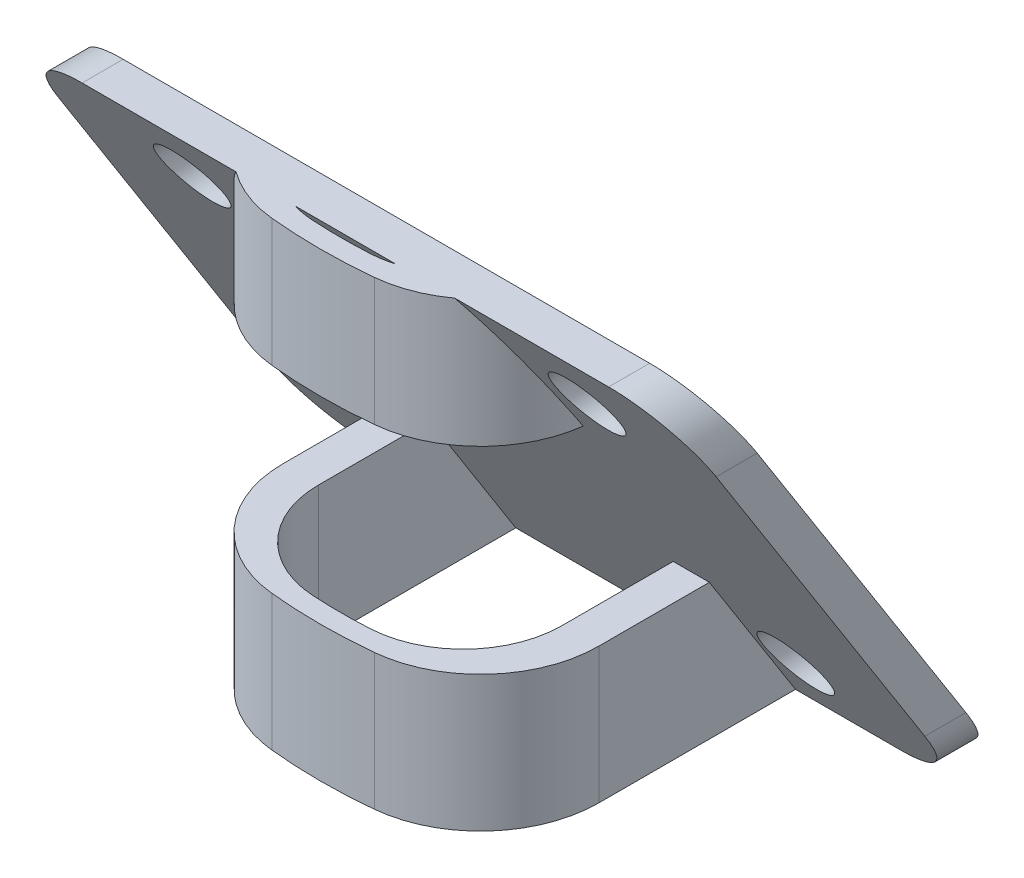
ISO-10303-21;
HEADER;
FILE_DESCRIPTION(('STEP AP214'),'2;1');
FILE_NAME('part.step','',(''),(''),'','','');
FILE_SCHEMA(('AUTOMOTIVE_DESIGN { 1 0 10303 214 1 1 1 1 }'));
ENDSEC;
DATA;
#1=APPLICATION_CONTEXT('core data for automotive mechanical design processes');
#2=APPLICATION_PROTOCOL_DEFINITION('international standard','automotive_design',2000,#1);
#3=PRODUCT_CONTEXT('',#1,'mechanical');
#4=PRODUCT('Part','Part','',(#3));
#5=PRODUCT_RELATED_PRODUCT_CATEGORY('part','',(#4));
#6=PRODUCT_DEFINITION_FORMATION('','',#4);
#7=PRODUCT_DEFINITION_CONTEXT('part definition',#1,'design');
#8=PRODUCT_DEFINITION('design','',#6,#7);
#9=PRODUCT_DEFINITION_SHAPE('','',#8);
#10=(LENGTH_UNIT() NAMED_UNIT(*) SI_UNIT(.MILLI.,.METRE.));
#11=(NAMED_UNIT(*) PLANE_ANGLE_UNIT() SI_UNIT($,.RADIAN.));
#12=(NAMED_UNIT(*) SI_UNIT($,.STERADIAN.) SOLID_ANGLE_UNIT());
#13=UNCERTAINTY_MEASURE_WITH_UNIT(LENGTH_MEASURE(1.E-05),#10,'distance_accuracy_value','');
#14=(GEOMETRIC_REPRESENTATION_CONTEXT(3) GLOBAL_UNCERTAINTY_ASSIGNED_CONTEXT((#13)) GLOBAL_UNIT_ASSIGNED_CONTEXT((#10,
#11,#12)) REPRESENTATION_CONTEXT('',''));
#15=CARTESIAN_POINT('',(0.,0.,0.));
#16=DIRECTION('',(0.,0.,1.));
#17=DIRECTION('',(1.,0.,0.));
#18=AXIS2_PLACEMENT_3D('',#15,#16,#17);
#19=CARTESIAN_POINT('',(26.,19.3633006070035,-108.491488000485));
#20=DIRECTION('',(1.,0.,0.));
#21=DIRECTION('',(0.,1.,0.));
#22=AXIS2_PLACEMENT_3D('',#19,#20,#21);
#23=PLANE('',#22);
#24=DIRECTION('',(0.,0.,1.));
#25=VECTOR('',#24,1.);
#26=CARTESIAN_POINT('',(26.,-50.6366993929965,-108.491488000485));
#27=LINE('',#26,#25);
#28=CARTESIAN_POINT('',(26.,-50.6366993929965,-37.9982236628717));
#29=VERTEX_POINT('',#28);
#30=CARTESIAN_POINT('',(26.,-50.6366993929965,-8.1341792972629));
#31=VERTEX_POINT('',#30);
#32=EDGE_CURVE('E250',#29,#31,#27,.T.);
#33=ORIENTED_EDGE('',*,*,#32,.T.);
#34=DIRECTION('',(0.,-1.,0.));
#35=VECTOR('',#34,1.);
#36=CARTESIAN_POINT('',(26.,-30.,-8.13417929726291));
#37=LINE('',#36,#35);
#38=CARTESIAN_POINT('',(26.,-30.,-8.1341792972629));
#39=VERTEX_POINT('',#38);
#40=EDGE_CURVE('E374',#31,#39,#37,.F.);
#41=ORIENTED_EDGE('',*,*,#40,.T.);
#42=DIRECTION('',(0.,0.,-1.));
#43=VECTOR('',#42,1.);
#44=CARTESIAN_POINT('',(26.,-30.,-108.491488000485));
#45=LINE('',#44,#43);
#46=CARTESIAN_POINT('',(26.,-30.,-24.9086112176693));
#47=VERTEX_POINT('',#46);
#48=EDGE_CURVE('E452',#39,#47,#45,.T.);
#49=ORIENTED_EDGE('',*,*,#48,.T.);
#50=DIRECTION('',(0.,0.844454440994229,0.535627386421871));
#51=VECTOR('',#50,1.);
#52=CARTESIAN_POINT('',(26.,-32.6044827871345,-26.5606036053357));
#53=LINE('',#52,#51);
#54=EDGE_CURVE('E246',#29,#47,#53,.T.);
#55=ORIENTED_EDGE('',*,*,#54,.F.);
#56=EDGE_LOOP('',(#33,#41,#49,#55));
#57=FACE_BOUND('',#56,.T.);
#58=ADVANCED_FACE('F35',(#57),#23,.F.);
#59=CARTESIAN_POINT('',(74.,19.3633006070035,-108.491488000485));
#60=DIRECTION('',(-1.,0.,0.));
#61=DIRECTION('',(0.,-1.,0.));
#62=AXIS2_PLACEMENT_3D('',#59,#60,#61);
#63=PLANE('',#62);
#64=DIRECTION('',(0.,0.,-1.));
#65=VECTOR('',#64,1.);
#66=CARTESIAN_POINT('',(74.,-30.,34.0291012034157));
#67=LINE('',#66,#65);
#68=CARTESIAN_POINT('',(74.,-30.,-8.13417929726291));
#69=VERTEX_POINT('',#68);
#70=CARTESIAN_POINT('',(74.,-30.,-24.9086112176693));
#71=VERTEX_POINT('',#70);
#72=EDGE_CURVE('E219',#69,#71,#67,.T.);
#73=ORIENTED_EDGE('',*,*,#72,.F.);
#74=DIRECTION('',(0.,-1.,0.));
#75=VECTOR('',#74,1.);
#76=CARTESIAN_POINT('',(74.,-50.6366993929965,-8.13417929726291));
#77=LINE('',#76,#75);
#78=CARTESIAN_POINT('',(74.,-50.6366993929965,-8.1341792972629));
#79=VERTEX_POINT('',#78);
#80=EDGE_CURVE('E361',#69,#79,#77,.T.);
#81=ORIENTED_EDGE('',*,*,#80,.T.);
#82=DIRECTION('',(0.,0.,1.));
#83=VECTOR('',#82,1.);
#84=CARTESIAN_POINT('',(74.,-50.6366993929965,-108.491488000485));
#85=LINE('',#84,#83);
#86=CARTESIAN_POINT('',(74.,-50.6366993929965,-37.9982236628717));
#87=VERTEX_POINT('',#86);
#88=EDGE_CURVE('E245',#87,#79,#85,.T.);
#89=ORIENTED_EDGE('',*,*,#88,.F.);
#90=DIRECTION('',(0.,-0.844454440994229,-0.535627386421871));
#91=VECTOR('',#90,1.);
#92=CARTESIAN_POINT('',(74.,-32.6044827871345,-26.5606036053357));
#93=LINE('',#92,#91);
#94=EDGE_CURVE('E236',#71,#87,#93,.T.);
#95=ORIENTED_EDGE('',*,*,#94,.F.);
#96=EDGE_LOOP('',(#73,#81,#89,#95));
#97=FACE_BOUND('',#96,.T.);
#98=ADVANCED_FACE('F243',(#97),#63,.F.);
#99=CARTESIAN_POINT('',(50.,-50.6366993929965,-68.2616321370809));
#100=DIRECTION('',(0.,1.,0.));
#101=DIRECTION('',(0.,0.,1.));
#102=AXIS2_PLACEMENT_3D('',#99,#100,#101);
#103=CYLINDRICAL_SURFACE('',#102,78.4260753731743);
#104=CARTESIAN_POINT('',(50.,-50.6366993929965,-68.2616321370809));
#105=DIRECTION('',(0.,1.,0.));
#106=DIRECTION('',(0.,0.,-1.));
#107=AXIS2_PLACEMENT_3D('',#104,#105,#106);
#108=CIRCLE('',#107,78.4260753731743);
#109=CARTESIAN_POINT('',(42.2126921311202,-50.6366993929965,9.77686563545502));
#110=VERTEX_POINT('',#109);
#111=CARTESIAN_POINT('',(57.7873078688798,-50.6366993929965,9.77686563545502));
#112=VERTEX_POINT('',#111);
#113=EDGE_CURVE('E247',#110,#112,#108,.T.);
#114=ORIENTED_EDGE('',*,*,#113,.T.);
#115=DIRECTION('',(0.,1.,0.));
#116=VECTOR('',#115,1.);
#117=CARTESIAN_POINT('',(57.7873078688798,-50.6366993929965,9.77686563545502));
#118=LINE('',#117,#116);
#119=CARTESIAN_POINT('',(57.7873078688798,-30.,9.77686563545502));
#120=VERTEX_POINT('',#119);
#121=EDGE_CURVE('E369',#112,#120,#118,.T.);
#122=ORIENTED_EDGE('',*,*,#121,.T.);
#123=CARTESIAN_POINT('',(50.,-30.,-68.2616321370809));
#124=DIRECTION('',(0.,-1.,0.));
#125=DIRECTION('',(1.,0.,0.));
#126=AXIS2_PLACEMENT_3D('',#123,#124,#125);
#127=CIRCLE('',#126,78.4260753731743);
#128=CARTESIAN_POINT('',(42.2126921311202,-30.,9.77686563545502));
#129=VERTEX_POINT('',#128);
#130=EDGE_CURVE('E457',#129,#120,#127,.F.);
#131=ORIENTED_EDGE('',*,*,#130,.F.);
#132=DIRECTION('',(0.,1.,0.));
#133=VECTOR('',#132,1.);
#134=CARTESIAN_POINT('',(42.2126921311202,-50.6366993929965,9.77686563545503));
#135=LINE('',#134,#133);
#136=EDGE_CURVE('E367',#129,#110,#135,.F.);
#137=ORIENTED_EDGE('',*,*,#136,.T.);
#138=EDGE_LOOP('',(#114,#122,#131,#137));
#139=FACE_BOUND('',#138,.T.);
#140=ADVANCED_FACE('F562',(#139),#103,.T.);
#141=CARTESIAN_POINT('',(50.,68.5170607209144,-68.2616321370809));
#142=DIRECTION('',(0.,-1.,0.));
#143=DIRECTION('',(0.,0.,-1.));
#144=AXIS2_PLACEMENT_3D('',#141,#142,#143);
#145=CYLINDRICAL_SURFACE('',#144,75.3486546940733);
#146=CARTESIAN_POINT('',(50.,-30.,-68.2616321370809));
#147=DIRECTION('',(0.,-1.,0.));
#148=DIRECTION('',(1.,0.,0.));
#149=AXIS2_PLACEMENT_3D('',#146,#147,#148);
#150=CIRCLE('',#149,75.3486546940733);
#151=CARTESIAN_POINT('',(45.6250623052723,-30.,6.95990523336866));
#152=VERTEX_POINT('',#151);
#153=CARTESIAN_POINT('',(54.3749376947277,-30.,6.95990523336866));
#154=VERTEX_POINT('',#153);
#155=EDGE_CURVE('E462',#152,#154,#150,.F.);
#156=ORIENTED_EDGE('',*,*,#155,.T.);
#157=DIRECTION('',(0.,-1.,0.));
#158=VECTOR('',#157,1.);
#159=CARTESIAN_POINT('',(54.3749376947277,68.5170607209144,6.95990523336866));
#160=LINE('',#159,#158);
#161=CARTESIAN_POINT('',(54.3749376947277,-50.6366993929965,6.95990523336866));
#162=VERTEX_POINT('',#161);
#163=EDGE_CURVE('E384',#154,#162,#160,.T.);
#164=ORIENTED_EDGE('',*,*,#163,.T.);
#165=CARTESIAN_POINT('',(50.,-50.6366993929965,-68.2616321370809));
#166=DIRECTION('',(0.,-1.,0.));
#167=DIRECTION('',(0.,0.,-1.));
#168=AXIS2_PLACEMENT_3D('',#165,#166,#167);
#169=CIRCLE('',#168,75.3486546940733);
#170=CARTESIAN_POINT('',(45.6250623052723,-50.6366993929965,6.95990523336866));
#171=VERTEX_POINT('',#170);
#172=EDGE_CURVE('E451',#162,#171,#169,.T.);
#173=ORIENTED_EDGE('',*,*,#172,.T.);
#174=DIRECTION('',(0.,-1.,0.));
#175=VECTOR('',#174,1.);
#176=CARTESIAN_POINT('',(45.6250623052723,68.5170607209144,6.95990523336866));
#177=LINE('',#176,#175);
#178=EDGE_CURVE('E382',#171,#152,#177,.F.);
#179=ORIENTED_EDGE('',*,*,#178,.T.);
#180=EDGE_LOOP('',(#156,#164,#173,#179));
#181=FACE_BOUND('',#180,.T.);
#182=ADVANCED_FACE('F539',(#181),#145,.F.);
#183=CARTESIAN_POINT('',(31.4960010856308,68.5170607209144,-37.9982236628717));
#184=DIRECTION('',(-1.,0.,0.));
#185=DIRECTION('',(0.,0.,1.));
#186=AXIS2_PLACEMENT_3D('',#183,#184,#185);
#187=PLANE('',#186);
#188=DIRECTION('',(0.,0.,1.));
#189=VECTOR('',#188,1.);
#190=CARTESIAN_POINT('',(31.4960010856308,-30.,-37.9982236628717));
#191=LINE('',#190,#189);
#192=CARTESIAN_POINT('',(31.4960010856308,-30.,-24.9086112176693));
#193=VERTEX_POINT('',#192);
#194=CARTESIAN_POINT('',(31.4960010856308,-30.,-8.01478894183463));
#195=VERTEX_POINT('',#194);
#196=EDGE_CURVE('E459',#193,#195,#191,.T.);
#197=ORIENTED_EDGE('',*,*,#196,.T.);
#198=DIRECTION('',(0.,1.,0.));
#199=VECTOR('',#198,1.);
#200=CARTESIAN_POINT('',(31.4960010856308,-50.6366993929965,-8.01478894183463));
#201=LINE('',#200,#199);
#202=CARTESIAN_POINT('',(31.4960010856308,-50.6366993929965,-8.01478894183463));
#203=VERTEX_POINT('',#202);
#204=EDGE_CURVE('E389',#195,#203,#201,.F.);
#205=ORIENTED_EDGE('',*,*,#204,.T.);
#206=DIRECTION('',(0.,0.,-1.));
#207=VECTOR('',#206,1.);
#208=CARTESIAN_POINT('',(31.4960010856308,-50.6366993929965,-37.9982236628717));
#209=LINE('',#208,#207);
#210=CARTESIAN_POINT('',(31.4960010856308,-50.6366993929965,-37.9982236628717));
#211=VERTEX_POINT('',#210);
#212=EDGE_CURVE('E447',#203,#211,#209,.T.);
#213=ORIENTED_EDGE('',*,*,#212,.T.);
#214=DIRECTION('',(0.,-0.844454440994229,-0.535627386421871));
#215=VECTOR('',#214,1.);
#216=CARTESIAN_POINT('',(31.4960010856308,34.3322404989602,15.8965621206953));
#217=LINE('',#216,#215);
#218=EDGE_CURVE('E441',#193,#211,#217,.T.);
#219=ORIENTED_EDGE('',*,*,#218,.F.);
#220=EDGE_LOOP('',(#197,#205,#213,#219));
#221=FACE_BOUND('',#220,.T.);
#222=ADVANCED_FACE('F530',(#221),#187,.F.);
#223=CARTESIAN_POINT('',(68.5039989143692,68.5170607209144,-37.9982236628717));
#224=DIRECTION('',(1.,0.,0.));
#225=DIRECTION('',(0.,0.,-1.));
#226=AXIS2_PLACEMENT_3D('',#223,#224,#225);
#227=PLANE('',#226);
#228=DIRECTION('',(0.,0.,1.));
#229=VECTOR('',#228,1.);
#230=CARTESIAN_POINT('',(68.5039989143692,-50.6366993929965,-37.9982236628717));
#231=LINE('',#230,#229);
#232=CARTESIAN_POINT('',(68.5039989143692,-50.6366993929965,-37.9982236628717));
#233=VERTEX_POINT('',#232);
#234=CARTESIAN_POINT('',(68.5039989143692,-50.6366993929965,-8.01478894183463));
#235=VERTEX_POINT('',#234);
#236=EDGE_CURVE('E448',#233,#235,#231,.T.);
#237=ORIENTED_EDGE('',*,*,#236,.T.);
#238=DIRECTION('',(0.,1.,0.));
#239=VECTOR('',#238,1.);
#240=CARTESIAN_POINT('',(68.5039989143692,-30.,-8.01478894183463));
#241=LINE('',#240,#239);
#242=CARTESIAN_POINT('',(68.5039989143692,-30.,-8.01478894183463));
#243=VERTEX_POINT('',#242);
#244=EDGE_CURVE('E387',#235,#243,#241,.T.);
#245=ORIENTED_EDGE('',*,*,#244,.T.);
#246=DIRECTION('',(0.,0.,-1.));
#247=VECTOR('',#246,1.);
#248=CARTESIAN_POINT('',(68.5039989143692,-30.,-37.9982236628717));
#249=LINE('',#248,#247);
#250=CARTESIAN_POINT('',(68.5039989143692,-30.,-24.9086112176693));
#251=VERTEX_POINT('',#250);
#252=EDGE_CURVE('E344',#243,#251,#249,.T.);
#253=ORIENTED_EDGE('',*,*,#252,.T.);
#254=DIRECTION('',(0.,0.844454440994229,0.535627386421871));
#255=VECTOR('',#254,1.);
#256=CARTESIAN_POINT('',(68.5039989143692,34.3322404989602,15.8965621206953));
#257=LINE('',#256,#255);
#258=EDGE_CURVE('E239',#233,#251,#257,.T.);
#259=ORIENTED_EDGE('',*,*,#258,.F.);
#260=EDGE_LOOP('',(#237,#245,#253,#259));
#261=FACE_BOUND('',#260,.T.);
#262=ADVANCED_FACE('F547',(#261),#227,.F.);
#263=CARTESIAN_POINT('',(100.,-37.9496908799031,-29.951005386206));
#264=DIRECTION('',(0.,0.535627386421871,-0.844454440994229));
#265=DIRECTION('',(0.,0.844454440994229,0.535627386421871));
#266=AXIS2_PLACEMENT_3D('',#263,#264,#265);
#267=PLANE('',#266);
#268=DIRECTION('',(1.,0.,0.));
#269=VECTOR('',#268,1.);
#270=CARTESIAN_POINT('',(18.,0.,-5.87996880359504));
#271=LINE('',#270,#269);
#272=CARTESIAN_POINT('',(68.3513065146503,0.,-5.87996880359504));
#273=VERTEX_POINT('',#272);
#274=CARTESIAN_POINT('',(73.8582903731079,0.,-5.87996880359504));
#275=VERTEX_POINT('',#274);
#276=EDGE_CURVE('E50',#273,#275,#271,.T.);
#277=ORIENTED_EDGE('',*,*,#276,.F.);
#278=CARTESIAN_POINT('',(53.5039989143692,-3.36569486953092,-8.01478894183463));
#279=DIRECTION('',(0.,0.535627386421871,-0.844454440994229));
#280=DIRECTION('',(0.,-0.844454440994229,-0.535627386421871));
#281=AXIS2_PLACEMENT_3D('',#278,#279,#280);
#282=ELLIPSE('',#281,28.0045426732264,15.);
#283=CARTESIAN_POINT('',(57.64620482628,19.3633006070035,6.40194196996817));
#284=VERTEX_POINT('',#283);
#285=EDGE_CURVE('E408',#273,#284,#282,.F.);
#286=ORIENTED_EDGE('',*,*,#285,.T.);
#287=DIRECTION('',(1.,0.,0.));
#288=VECTOR('',#287,1.);
#289=CARTESIAN_POINT('',(100.,19.3633006070035,6.40194196996817));
#290=LINE('',#289,#288);
#291=CARTESIAN_POINT('',(42.35379517372,19.3633006070035,6.40194196996817));
#292=VERTEX_POINT('',#291);
#293=EDGE_CURVE('E433',#292,#284,#290,.T.);
#294=ORIENTED_EDGE('',*,*,#293,.F.);
#295=CARTESIAN_POINT('',(46.4960010856308,-3.36569486953092,-8.01478894183463));
#296=DIRECTION('',(0.,0.535627386421871,-0.844454440994229));
#297=DIRECTION('',(0.,-0.844454440994229,-0.535627386421871));
#298=AXIS2_PLACEMENT_3D('',#295,#296,#297);
#299=ELLIPSE('',#298,28.0045426732264,15.);
#300=CARTESIAN_POINT('',(31.6486934853497,0.,-5.87996880359504));
#301=VERTEX_POINT('',#300);
#302=EDGE_CURVE('E406',#292,#301,#299,.F.);
#303=ORIENTED_EDGE('',*,*,#302,.T.);
#304=CARTESIAN_POINT('',(26.1417096268921,0.,-5.87996880359504));
#305=VERTEX_POINT('',#304);
#306=EDGE_CURVE('E58',#305,#301,#271,.T.);
#307=ORIENTED_EDGE('',*,*,#306,.F.);
#308=CARTESIAN_POINT('',(44.,-3.55392220519198,-8.13417929726291));
#309=DIRECTION('',(0.,0.535627386421871,-0.844454440994229));
#310=DIRECTION('',(0.,0.844454440994229,0.535627386421871));
#311=AXIS2_PLACEMENT_3D('',#308,#309,#310);
#312=ELLIPSE('',#311,33.6054512078717,18.);
#313=CARTESIAN_POINT('',(33.3839188725617,19.3633006070035,6.40194196996817));
#314=VERTEX_POINT('',#313);
#315=EDGE_CURVE('E379',#305,#314,#312,.T.);
#316=ORIENTED_EDGE('',*,*,#315,.T.);
#317=DIRECTION('',(-1.,0.,0.));
#318=VECTOR('',#317,1.);
#319=CARTESIAN_POINT('',(100.,19.3633006070035,6.40194196996819));
#320=LINE('',#319,#318);
#321=CARTESIAN_POINT('',(9.99999999999999,19.3633006070035,6.40194196996819));
#322=VERTEX_POINT('',#321);
#323=EDGE_CURVE('E297',#314,#322,#320,.T.);
#324=ORIENTED_EDGE('',*,*,#323,.T.);
#325=CARTESIAN_POINT('',(9.99999999999999,9.36330060700352,0.0590611652767669));
#326=DIRECTION('',(0.,0.535627386421871,-0.844454440994229));
#327=DIRECTION('',(0.,-0.844454440994229,-0.535627386421871));
#328=AXIS2_PLACEMENT_3D('',#325,#326,#327);
#329=ELLIPSE('',#328,11.8419650777446,10.);
#330=CARTESIAN_POINT('',(0.,9.36330060700352,0.0590611652767706));
#331=VERTEX_POINT('',#330);
#332=EDGE_CURVE('E325',#322,#331,#329,.F.);
#333=ORIENTED_EDGE('',*,*,#332,.T.);
#334=DIRECTION('',(0.,-0.844454440994229,-0.535627386421871));
#335=VECTOR('',#334,1.);
#336=CARTESIAN_POINT('',(0.,-37.9496908799031,-29.951005386206));
#337=LINE('',#336,#335);
#338=CARTESIAN_POINT('',(0.,-40.6366993929965,-31.6553428581803));
#339=VERTEX_POINT('',#338);
#340=EDGE_CURVE('E276',#331,#339,#337,.T.);
#341=ORIENTED_EDGE('',*,*,#340,.T.);
#342=CARTESIAN_POINT('',(9.99999999999999,-40.6366993929965,-31.6553428581803));
#343=DIRECTION('',(0.,0.535627386421871,-0.844454440994229));
#344=DIRECTION('',(0.,0.844454440994229,0.535627386421871));
#345=AXIS2_PLACEMENT_3D('',#342,#343,#344);
#346=ELLIPSE('',#345,11.8419650777446,10.);
#347=CARTESIAN_POINT('',(9.99999999999999,-50.6366993929965,-37.9982236628717));
#348=VERTEX_POINT('',#347);
#349=EDGE_CURVE('E327',#339,#348,#346,.F.);
#350=ORIENTED_EDGE('',*,*,#349,.T.);
#351=DIRECTION('',(-1.,0.,0.));
#352=VECTOR('',#351,1.);
#353=CARTESIAN_POINT('',(100.,-50.6366993929965,-37.9982236628717));
#354=LINE('',#353,#352);
#355=EDGE_CURVE('E294',#29,#348,#354,.T.);
#356=ORIENTED_EDGE('',*,*,#355,.F.);
#357=ORIENTED_EDGE('',*,*,#54,.T.);
#358=DIRECTION('',(1.,0.,0.));
#359=VECTOR('',#358,1.);
#360=CARTESIAN_POINT('',(18.,-30.,-24.9086112176693));
#361=LINE('',#360,#359);
#362=EDGE_CURVE('E240',#47,#193,#361,.T.);
#363=ORIENTED_EDGE('',*,*,#362,.T.);
#364=ORIENTED_EDGE('',*,*,#218,.T.);
#365=DIRECTION('',(1.,0.,0.));
#366=VECTOR('',#365,1.);
#367=CARTESIAN_POINT('',(68.5039989143692,-50.6366993929965,-37.9982236628717));
#368=LINE('',#367,#366);
#369=EDGE_CURVE('E444',#211,#233,#368,.T.);
#370=ORIENTED_EDGE('',*,*,#369,.T.);
#371=ORIENTED_EDGE('',*,*,#258,.T.);
#372=EDGE_CURVE('E224',#251,#71,#361,.T.);
#373=ORIENTED_EDGE('',*,*,#372,.T.);
#374=ORIENTED_EDGE('',*,*,#94,.T.);
#375=CARTESIAN_POINT('',(90.,-50.6366993929965,-37.9982236628717));
#376=VERTEX_POINT('',#375);
#377=EDGE_CURVE('E295',#376,#87,#354,.T.);
#378=ORIENTED_EDGE('',*,*,#377,.F.);
#379=CARTESIAN_POINT('',(90.,-40.6366993929965,-31.6553428581803));
#380=DIRECTION('',(0.,0.535627386421871,-0.844454440994229));
#381=DIRECTION('',(0.,-0.844454440994229,-0.535627386421871));
#382=AXIS2_PLACEMENT_3D('',#379,#380,#381);
#383=ELLIPSE('',#382,11.8419650777446,10.);
#384=CARTESIAN_POINT('',(100.,-40.6366993929965,-31.6553428581803));
#385=VERTEX_POINT('',#384);
#386=EDGE_CURVE('E337',#376,#385,#383,.F.);
#387=ORIENTED_EDGE('',*,*,#386,.T.);
#388=DIRECTION('',(0.,-0.844454440994229,-0.535627386421871));
#389=VECTOR('',#388,1.);
#390=CARTESIAN_POINT('',(100.,-5.42282335545548,-9.3196010204501));
#391=LINE('',#390,#389);
#392=CARTESIAN_POINT('',(100.,9.36330060700351,0.0590611652767793));
#393=VERTEX_POINT('',#392);
#394=EDGE_CURVE('E277',#393,#385,#391,.T.);
#395=ORIENTED_EDGE('',*,*,#394,.F.);
#396=CARTESIAN_POINT('',(90.,9.36330060700352,0.0590611652767689));
#397=DIRECTION('',(0.,0.535627386421871,-0.844454440994229));
#398=DIRECTION('',(0.,0.844454440994229,0.535627386421871));
#399=AXIS2_PLACEMENT_3D('',#396,#397,#398);
#400=ELLIPSE('',#399,11.8419650777446,10.);
#401=CARTESIAN_POINT('',(90.,19.3633006070035,6.40194196996819));
#402=VERTEX_POINT('',#401);
#403=EDGE_CURVE('E335',#393,#402,#400,.F.);
#404=ORIENTED_EDGE('',*,*,#403,.T.);
#405=CARTESIAN_POINT('',(66.6160811274383,19.3633006070035,6.40194196996818));
#406=VERTEX_POINT('',#405);
#407=EDGE_CURVE('E298',#402,#406,#320,.T.);
#408=ORIENTED_EDGE('',*,*,#407,.T.);
#409=CARTESIAN_POINT('',(56.,-3.55392220519198,-8.13417929726291));
#410=DIRECTION('',(0.,0.535627386421871,-0.844454440994229));
#411=DIRECTION('',(0.,0.844454440994229,0.535627386421871));
#412=AXIS2_PLACEMENT_3D('',#409,#410,#411);
#413=ELLIPSE('',#412,33.6054512078717,18.);
#414=EDGE_CURVE('E377',#406,#275,#413,.T.);
#415=ORIENTED_EDGE('',*,*,#414,.T.);
#416=EDGE_LOOP('',(#277,#286,#294,#303,#307,#316,#324,#333,#341,#350,#356,#357,#363,#364,#370,
#371,#373,#374,#378,#387,#395,#404,#408,#415));
#417=FACE_BOUND('',#416,.T.);
#418=CARTESIAN_POINT('',(80.,-41.2363856699756,-32.035716715689));
#419=DIRECTION('',(0.,0.535627386421871,-0.844454440994229));
#420=DIRECTION('',(0.,-0.844454440994229,-0.535627386421871));
#421=AXIS2_PLACEMENT_3D('',#418,#419,#420);
#422=ELLIPSE('',#421,5.92098253887231,5.00000000000001);
#423=CARTESIAN_POINT('',(80.,-46.2363856699756,-35.2071571180347));
#424=VERTEX_POINT('',#423);
#425=EDGE_CURVE('E261',#424,#424,#422,.T.);
#426=ORIENTED_EDGE('',*,*,#425,.T.);
#427=EDGE_LOOP('',(#426));
#428=FACE_BOUND('',#427,.T.);
#429=CARTESIAN_POINT('',(80.,8.76361433002444,-0.321312692231977));
#430=DIRECTION('',(0.,0.535627386421871,-0.844454440994229));
#431=DIRECTION('',(0.,-0.844454440994229,-0.535627386421871));
#432=AXIS2_PLACEMENT_3D('',#429,#430,#431);
#433=ELLIPSE('',#432,5.92098253887231,5.);
#434=CARTESIAN_POINT('',(80.,3.76361433002443,-3.49275309457768));
#435=VERTEX_POINT('',#434);
#436=EDGE_CURVE('E273',#435,#435,#433,.T.);
#437=ORIENTED_EDGE('',*,*,#436,.T.);
#438=EDGE_LOOP('',(#437));
#439=FACE_BOUND('',#438,.T.);
#440=CARTESIAN_POINT('',(20.,-41.2363856699756,-32.035716715689));
#441=DIRECTION('',(0.,0.535627386421871,-0.844454440994229));
#442=DIRECTION('',(0.,-0.844454440994229,-0.535627386421871));
#443=AXIS2_PLACEMENT_3D('',#440,#441,#442);
#444=ELLIPSE('',#443,5.9209825388723,5.);
#445=CARTESIAN_POINT('',(20.,-46.2363856699756,-35.2071571180347));
#446=VERTEX_POINT('',#445);
#447=EDGE_CURVE('E265',#446,#446,#444,.T.);
#448=ORIENTED_EDGE('',*,*,#447,.T.);
#449=EDGE_LOOP('',(#448));
#450=FACE_BOUND('',#449,.T.);
#451=CARTESIAN_POINT('',(20.,8.76361433002444,-0.321312692231977));
#452=DIRECTION('',(0.,0.535627386421871,-0.844454440994229));
#453=DIRECTION('',(0.,-0.844454440994229,-0.535627386421871));
#454=AXIS2_PLACEMENT_3D('',#451,#452,#453);
#455=ELLIPSE('',#454,5.9209825388723,5.);
#456=CARTESIAN_POINT('',(20.,3.76361433002444,-3.49275309457768));
#457=VERTEX_POINT('',#456);
#458=EDGE_CURVE('E269',#457,#457,#455,.T.);
#459=ORIENTED_EDGE('',*,*,#458,.T.);
#460=EDGE_LOOP('',(#459));
#461=FACE_BOUND('',#460,.T.);
#462=ADVANCED_FACE('F233',(#417,#428,#439,#450,#461),#267,.F.);
#463=CARTESIAN_POINT('',(100.,19.3633006070035,0.16444323609336));
#464=DIRECTION('',(0.,-1.,0.));
#465=DIRECTION('',(0.,0.,-1.));
#466=AXIS2_PLACEMENT_3D('',#463,#464,#465);
#467=PLANE('',#466);
#468=ORIENTED_EDGE('',*,*,#293,.T.);
#469=CARTESIAN_POINT('',(53.5039989143692,19.3633006070035,-8.01478894183463));
#470=DIRECTION('',(0.,-1.,0.));
#471=DIRECTION('',(0.,0.,-1.));
#472=AXIS2_PLACEMENT_3D('',#469,#470,#471);
#473=CIRCLE('',#472,15.);
#474=CARTESIAN_POINT('',(54.3749376947277,19.3633006070035,6.95990523336866));
#475=VERTEX_POINT('',#474);
#476=EDGE_CURVE('E412',#284,#475,#473,.T.);
#477=ORIENTED_EDGE('',*,*,#476,.T.);
#478=CARTESIAN_POINT('',(50.,19.3633006070035,-68.2616321370809));
#479=DIRECTION('',(0.,-1.,0.));
#480=DIRECTION('',(0.,0.,-1.));
#481=AXIS2_PLACEMENT_3D('',#478,#479,#480);
#482=CIRCLE('',#481,75.3486546940733);
#483=CARTESIAN_POINT('',(45.6250623052723,19.3633006070035,6.95990523336866));
#484=VERTEX_POINT('',#483);
#485=EDGE_CURVE('E435',#475,#484,#482,.T.);
#486=ORIENTED_EDGE('',*,*,#485,.T.);
#487=CARTESIAN_POINT('',(46.4960010856308,19.3633006070035,-8.01478894183463));
#488=DIRECTION('',(0.,-1.,0.));
#489=DIRECTION('',(0.,0.,-1.));
#490=AXIS2_PLACEMENT_3D('',#487,#488,#489);
#491=CIRCLE('',#490,15.);
#492=EDGE_CURVE('E11',#484,#292,#491,.T.);
#493=ORIENTED_EDGE('',*,*,#492,.T.);
#494=EDGE_LOOP('',(#468,#477,#486,#493));
#495=FACE_BOUND('',#494,.T.);
#496=CARTESIAN_POINT('',(56.,19.3633006070035,-8.13417929726291));
#497=DIRECTION('',(0.,-1.,0.));
#498=DIRECTION('',(0.,0.,-1.));
#499=AXIS2_PLACEMENT_3D('',#496,#497,#498);
#500=CIRCLE('',#499,18.);
#501=CARTESIAN_POINT('',(57.7873078688798,19.3633006070035,9.77686563545502));
#502=VERTEX_POINT('',#501);
#503=EDGE_CURVE('E358',#502,#406,#500,.F.);
#504=ORIENTED_EDGE('',*,*,#503,.T.);
#505=ORIENTED_EDGE('',*,*,#407,.F.);
#506=DIRECTION('',(0.,0.,1.));
#507=VECTOR('',#506,1.);
#508=CARTESIAN_POINT('',(90.,19.3633006070035,0.16444323609336));
#509=LINE('',#508,#507);
#510=CARTESIAN_POINT('',(90.,19.3633006070035,0.16444323609336));
#511=VERTEX_POINT('',#510);
#512=EDGE_CURVE('E339',#402,#511,#509,.F.);
#513=ORIENTED_EDGE('',*,*,#512,.T.);
#514=DIRECTION('',(-1.,0.,0.));
#515=VECTOR('',#514,1.);
#516=CARTESIAN_POINT('',(100.,19.3633006070035,0.16444323609336));
#517=LINE('',#516,#515);
#518=CARTESIAN_POINT('',(9.99999999999999,19.3633006070035,0.16444323609336));
#519=VERTEX_POINT('',#518);
#520=EDGE_CURVE('E284',#511,#519,#517,.T.);
#521=ORIENTED_EDGE('',*,*,#520,.T.);
#522=DIRECTION('',(0.,0.,1.));
#523=VECTOR('',#522,1.);
#524=CARTESIAN_POINT('',(9.99999999999999,19.3633006070035,6.40194196996819));
#525=LINE('',#524,#523);
#526=EDGE_CURVE('E341',#519,#322,#525,.T.);
#527=ORIENTED_EDGE('',*,*,#526,.T.);
#528=ORIENTED_EDGE('',*,*,#323,.F.);
#529=CARTESIAN_POINT('',(44.,19.3633006070035,-8.13417929726291));
#530=DIRECTION('',(0.,-1.,0.));
#531=DIRECTION('',(0.,0.,-1.));
#532=AXIS2_PLACEMENT_3D('',#529,#530,#531);
#533=CIRCLE('',#532,18.);
#534=CARTESIAN_POINT('',(42.2126921311202,19.3633006070035,9.77686563545502));
#535=VERTEX_POINT('',#534);
#536=EDGE_CURVE('E356',#314,#535,#533,.F.);
#537=ORIENTED_EDGE('',*,*,#536,.T.);
#538=CARTESIAN_POINT('',(50.,19.3633006070035,-68.2616321370809));
#539=DIRECTION('',(0.,1.,0.));
#540=DIRECTION('',(0.,0.,-1.));
#541=AXIS2_PLACEMENT_3D('',#538,#539,#540);
#542=CIRCLE('',#541,78.4260753731743);
#543=EDGE_CURVE('E253',#535,#502,#542,.T.);
#544=ORIENTED_EDGE('',*,*,#543,.T.);
#545=EDGE_LOOP('',(#504,#505,#513,#521,#527,#528,#537,#544));
#546=FACE_BOUND('',#545,.T.);
#547=ADVANCED_FACE('F431',(#495,#546),#467,.F.);
#548=CARTESIAN_POINT('',(100.,-50.6366993929965,-37.9982236628717));
#549=DIRECTION('',(0.,1.,0.));
#550=DIRECTION('',(0.,0.,1.));
#551=AXIS2_PLACEMENT_3D('',#548,#549,#550);
#552=PLANE('',#551);
#553=ORIENTED_EDGE('',*,*,#369,.F.);
#554=ORIENTED_EDGE('',*,*,#212,.F.);
#555=CARTESIAN_POINT('',(46.4960010856308,-50.6366993929965,-8.01478894183463));
#556=DIRECTION('',(0.,1.,0.));
#557=DIRECTION('',(0.,0.,1.));
#558=AXIS2_PLACEMENT_3D('',#555,#556,#557);
#559=CIRCLE('',#558,15.);
#560=EDGE_CURVE('E396',#203,#171,#559,.T.);
#561=ORIENTED_EDGE('',*,*,#560,.T.);
#562=ORIENTED_EDGE('',*,*,#172,.F.);
#563=CARTESIAN_POINT('',(53.5039989143692,-50.6366993929965,-8.01478894183463));
#564=DIRECTION('',(0.,1.,0.));
#565=DIRECTION('',(0.,0.,1.));
#566=AXIS2_PLACEMENT_3D('',#563,#564,#565);
#567=CIRCLE('',#566,15.);
#568=EDGE_CURVE('E392',#162,#235,#567,.T.);
#569=ORIENTED_EDGE('',*,*,#568,.T.);
#570=ORIENTED_EDGE('',*,*,#236,.F.);
#571=EDGE_LOOP('',(#553,#554,#561,#562,#569,#570));
#572=FACE_BOUND('',#571,.T.);
#573=ORIENTED_EDGE('',*,*,#88,.T.);
#574=CARTESIAN_POINT('',(56.,-50.6366993929965,-8.13417929726291));
#575=DIRECTION('',(0.,1.,0.));
#576=DIRECTION('',(0.,0.,1.));
#577=AXIS2_PLACEMENT_3D('',#574,#575,#576);
#578=CIRCLE('',#577,18.);
#579=EDGE_CURVE('E365',#79,#112,#578,.F.);
#580=ORIENTED_EDGE('',*,*,#579,.T.);
#581=ORIENTED_EDGE('',*,*,#113,.F.);
#582=CARTESIAN_POINT('',(44.,-50.6366993929965,-8.13417929726291));
#583=DIRECTION('',(0.,1.,0.));
#584=DIRECTION('',(0.,0.,1.));
#585=AXIS2_PLACEMENT_3D('',#582,#583,#584);
#586=CIRCLE('',#585,18.);
#587=EDGE_CURVE('E363',#110,#31,#586,.F.);
#588=ORIENTED_EDGE('',*,*,#587,.T.);
#589=ORIENTED_EDGE('',*,*,#32,.F.);
#590=ORIENTED_EDGE('',*,*,#355,.T.);
#591=DIRECTION('',(0.,0.,-1.));
#592=VECTOR('',#591,1.);
#593=CARTESIAN_POINT('',(9.99999999999999,-50.6366993929965,-44.2357223967465));
#594=LINE('',#593,#592);
#595=CARTESIAN_POINT('',(9.99999999999999,-50.6366993929965,-44.2357223967465));
#596=VERTEX_POINT('',#595);
#597=EDGE_CURVE('E310',#348,#596,#594,.T.);
#598=ORIENTED_EDGE('',*,*,#597,.T.);
#599=DIRECTION('',(-1.,0.,0.));
#600=VECTOR('',#599,1.);
#601=CARTESIAN_POINT('',(100.,-50.6366993929965,-44.2357223967465));
#602=LINE('',#601,#600);
#603=CARTESIAN_POINT('',(90.,-50.6366993929965,-44.2357223967465));
#604=VERTEX_POINT('',#603);
#605=EDGE_CURVE('E291',#604,#596,#602,.T.);
#606=ORIENTED_EDGE('',*,*,#605,.F.);
#607=DIRECTION('',(0.,0.,-1.));
#608=VECTOR('',#607,1.);
#609=CARTESIAN_POINT('',(90.,-50.6366993929965,-37.9982236628717));
#610=LINE('',#609,#608);
#611=EDGE_CURVE('E300',#604,#376,#610,.F.);
#612=ORIENTED_EDGE('',*,*,#611,.T.);
#613=ORIENTED_EDGE('',*,*,#377,.T.);
#614=EDGE_LOOP('',(#573,#580,#581,#588,#589,#590,#598,#606,#612,#613));
#615=FACE_BOUND('',#614,.T.);
#616=ADVANCED_FACE('F513',(#572,#615),#552,.F.);
#617=CARTESIAN_POINT('',(100.,19.3633006070035,0.16444323609336));
#618=DIRECTION('',(0.,-0.535627386421871,0.844454440994229));
#619=DIRECTION('',(0.,-0.844454440994229,-0.535627386421871));
#620=AXIS2_PLACEMENT_3D('',#617,#618,#619);
#621=PLANE('',#620);
#622=CARTESIAN_POINT('',(80.,8.76361433002444,-6.55881142610679));
#623=DIRECTION('',(0.,-0.535627386421871,0.844454440994229));
#624=DIRECTION('',(0.,-0.844454440994229,-0.535627386421871));
#625=AXIS2_PLACEMENT_3D('',#622,#623,#624);
#626=ELLIPSE('',#625,5.92098253887231,5.);
#627=CARTESIAN_POINT('',(80.,3.76361433002443,-9.7302518284525));
#628=VERTEX_POINT('',#627);
#629=EDGE_CURVE('E272',#628,#628,#626,.T.);
#630=ORIENTED_EDGE('',*,*,#629,.T.);
#631=EDGE_LOOP('',(#630));
#632=FACE_BOUND('',#631,.T.);
#633=CARTESIAN_POINT('',(20.,8.76361433002444,-6.55881142610679));
#634=DIRECTION('',(0.,-0.535627386421871,0.844454440994229));
#635=DIRECTION('',(0.,-0.844454440994229,-0.535627386421871));
#636=AXIS2_PLACEMENT_3D('',#633,#634,#635);
#637=ELLIPSE('',#636,5.9209825388723,5.);
#638=CARTESIAN_POINT('',(20.,3.76361433002443,-9.7302518284525));
#639=VERTEX_POINT('',#638);
#640=EDGE_CURVE('E268',#639,#639,#637,.T.);
#641=ORIENTED_EDGE('',*,*,#640,.T.);
#642=EDGE_LOOP('',(#641));
#643=FACE_BOUND('',#642,.T.);
#644=CARTESIAN_POINT('',(20.,-41.2363856699756,-38.2732154495638));
#645=DIRECTION('',(0.,-0.535627386421871,0.844454440994229));
#646=DIRECTION('',(0.,-0.844454440994229,-0.535627386421871));
#647=AXIS2_PLACEMENT_3D('',#644,#645,#646);
#648=ELLIPSE('',#647,5.9209825388723,5.);
#649=CARTESIAN_POINT('',(20.,-46.2363856699756,-41.4446558519095));
#650=VERTEX_POINT('',#649);
#651=EDGE_CURVE('E264',#650,#650,#648,.T.);
#652=ORIENTED_EDGE('',*,*,#651,.T.);
#653=EDGE_LOOP('',(#652));
#654=FACE_BOUND('',#653,.T.);
#655=CARTESIAN_POINT('',(80.,-41.2363856699756,-38.2732154495638));
#656=DIRECTION('',(0.,-0.535627386421871,0.844454440994229));
#657=DIRECTION('',(0.,-0.844454440994229,-0.535627386421871));
#658=AXIS2_PLACEMENT_3D('',#655,#656,#657);
#659=ELLIPSE('',#658,5.92098253887231,5.00000000000001);
#660=CARTESIAN_POINT('',(80.,-46.2363856699756,-41.4446558519095));
#661=VERTEX_POINT('',#660);
#662=EDGE_CURVE('E258',#661,#661,#659,.T.);
#663=ORIENTED_EDGE('',*,*,#662,.T.);
#664=EDGE_LOOP('',(#663));
#665=FACE_BOUND('',#664,.T.);
#666=ORIENTED_EDGE('',*,*,#605,.T.);
#667=CARTESIAN_POINT('',(9.99999999999999,-40.6366993929965,-37.8928415920551));
#668=DIRECTION('',(0.,-0.535627386421871,0.844454440994229));
#669=DIRECTION('',(0.,0.844454440994229,0.535627386421871));
#670=AXIS2_PLACEMENT_3D('',#667,#668,#669);
#671=ELLIPSE('',#670,11.8419650777446,10.);
#672=CARTESIAN_POINT('',(0.,-40.6366993929965,-37.8928415920551));
#673=VERTEX_POINT('',#672);
#674=EDGE_CURVE('E319',#596,#673,#671,.F.);
#675=ORIENTED_EDGE('',*,*,#674,.T.);
#676=DIRECTION('',(0.,0.844454440994229,0.535627386421871));
#677=VECTOR('',#676,1.);
#678=CARTESIAN_POINT('',(0.,19.3633006070035,0.16444323609336));
#679=LINE('',#678,#677);
#680=CARTESIAN_POINT('',(0.,9.36330060700351,-6.17843756859805));
#681=VERTEX_POINT('',#680);
#682=EDGE_CURVE('E281',#673,#681,#679,.T.);
#683=ORIENTED_EDGE('',*,*,#682,.T.);
#684=CARTESIAN_POINT('',(9.99999999999999,9.36330060700352,-6.17843756859805));
#685=DIRECTION('',(0.,-0.535627386421871,0.844454440994229));
#686=DIRECTION('',(0.,-0.844454440994229,-0.535627386421871));
#687=AXIS2_PLACEMENT_3D('',#684,#685,#686);
#688=ELLIPSE('',#687,11.8419650777446,10.);
#689=EDGE_CURVE('E315',#681,#519,#688,.F.);
#690=ORIENTED_EDGE('',*,*,#689,.T.);
#691=ORIENTED_EDGE('',*,*,#520,.F.);
#692=CARTESIAN_POINT('',(90.,9.36330060700352,-6.17843756859805));
#693=DIRECTION('',(0.,-0.535627386421871,0.844454440994229));
#694=DIRECTION('',(0.,0.844454440994229,0.535627386421871));
#695=AXIS2_PLACEMENT_3D('',#692,#693,#694);
#696=ELLIPSE('',#695,11.8419650777446,10.);
#697=CARTESIAN_POINT('',(100.,9.36330060700351,-6.17843756859805));
#698=VERTEX_POINT('',#697);
#699=EDGE_CURVE('E313',#511,#698,#696,.F.);
#700=ORIENTED_EDGE('',*,*,#699,.T.);
#701=DIRECTION('',(0.,0.844454440994229,0.535627386421871));
#702=VECTOR('',#701,1.);
#703=CARTESIAN_POINT('',(100.,19.3633006070035,0.16444323609336));
#704=LINE('',#703,#702);
#705=CARTESIAN_POINT('',(100.,-40.6366993929965,-37.8928415920551));
#706=VERTEX_POINT('',#705);
#707=EDGE_CURVE('E280',#706,#698,#704,.T.);
#708=ORIENTED_EDGE('',*,*,#707,.F.);
#709=CARTESIAN_POINT('',(90.,-40.6366993929965,-37.8928415920551));
#710=DIRECTION('',(0.,-0.535627386421871,0.844454440994229));
#711=DIRECTION('',(0.,-0.844454440994229,-0.535627386421871));
#712=AXIS2_PLACEMENT_3D('',#709,#710,#711);
#713=ELLIPSE('',#712,11.8419650777446,10.);
#714=EDGE_CURVE('E317',#706,#604,#713,.F.);
#715=ORIENTED_EDGE('',*,*,#714,.T.);
#716=EDGE_LOOP('',(#666,#675,#683,#690,#691,#700,#708,#715));
#717=FACE_BOUND('',#716,.T.);
#718=ADVANCED_FACE('F496',(#632,#643,#654,#665,#717),#621,.F.);
#719=CARTESIAN_POINT('',(100.,0.,0.));
#720=DIRECTION('',(-1.,0.,0.));
#721=DIRECTION('',(0.,0.,1.));
#722=AXIS2_PLACEMENT_3D('',#719,#720,#721);
#723=PLANE('',#722);
#724=ORIENTED_EDGE('',*,*,#394,.T.);
#725=DIRECTION('',(0.,0.,-1.));
#726=VECTOR('',#725,1.);
#727=CARTESIAN_POINT('',(100.,-40.6366993929965,0.));
#728=LINE('',#727,#726);
#729=EDGE_CURVE('E332',#385,#706,#728,.T.);
#730=ORIENTED_EDGE('',*,*,#729,.T.);
#731=ORIENTED_EDGE('',*,*,#707,.T.);
#732=DIRECTION('',(0.,0.,1.));
#733=VECTOR('',#732,1.);
#734=CARTESIAN_POINT('',(100.,9.36330060700352,0.));
#735=LINE('',#734,#733);
#736=EDGE_CURVE('E329',#698,#393,#735,.T.);
#737=ORIENTED_EDGE('',*,*,#736,.T.);
#738=EDGE_LOOP('',(#724,#730,#731,#737));
#739=FACE_BOUND('',#738,.T.);
#740=ADVANCED_FACE('F504',(#739),#723,.F.);
#741=CARTESIAN_POINT('',(0.,0.,0.));
#742=DIRECTION('',(-1.,0.,0.));
#743=DIRECTION('',(0.,0.,1.));
#744=AXIS2_PLACEMENT_3D('',#741,#742,#743);
#745=PLANE('',#744);
#746=ORIENTED_EDGE('',*,*,#682,.F.);
#747=DIRECTION('',(0.,0.,-1.));
#748=VECTOR('',#747,1.);
#749=CARTESIAN_POINT('',(0.,-40.6366993929965,-37.9982236628717));
#750=LINE('',#749,#748);
#751=EDGE_CURVE('E323',#673,#339,#750,.F.);
#752=ORIENTED_EDGE('',*,*,#751,.T.);
#753=ORIENTED_EDGE('',*,*,#340,.F.);
#754=DIRECTION('',(0.,0.,1.));
#755=VECTOR('',#754,1.);
#756=CARTESIAN_POINT('',(0.,9.36330060700352,0.16444323609336));
#757=LINE('',#756,#755);
#758=EDGE_CURVE('E321',#331,#681,#757,.F.);
#759=ORIENTED_EDGE('',*,*,#758,.T.);
#760=EDGE_LOOP('',(#746,#752,#753,#759));
#761=FACE_BOUND('',#760,.T.);
#762=ADVANCED_FACE('F490',(#761),#745,.T.);
#763=CARTESIAN_POINT('',(80.,-41.2363856699756,16.7642776032535));
#764=DIRECTION('',(0.,0.,-1.));
#765=DIRECTION('',(0.,1.,0.));
#766=AXIS2_PLACEMENT_3D('',#763,#764,#765);
#767=CYLINDRICAL_SURFACE('',#766,5.00000000000001);
#768=ORIENTED_EDGE('',*,*,#662,.F.);
#769=EDGE_LOOP('',(#768));
#770=FACE_BOUND('',#769,.T.);
#771=ORIENTED_EDGE('',*,*,#425,.F.);
#772=EDGE_LOOP('',(#771));
#773=FACE_BOUND('',#772,.T.);
#774=ADVANCED_FACE('F570',(#770,#773),#767,.F.);
#775=CARTESIAN_POINT('',(20.,-41.2363856699756,16.7642776032535));
#776=DIRECTION('',(0.,0.,-1.));
#777=DIRECTION('',(0.,1.,0.));
#778=AXIS2_PLACEMENT_3D('',#775,#776,#777);
#779=CYLINDRICAL_SURFACE('',#778,5.);
#780=ORIENTED_EDGE('',*,*,#651,.F.);
#781=EDGE_LOOP('',(#780));
#782=FACE_BOUND('',#781,.T.);
#783=ORIENTED_EDGE('',*,*,#447,.F.);
#784=EDGE_LOOP('',(#783));
#785=FACE_BOUND('',#784,.T.);
#786=ADVANCED_FACE('F566',(#782,#785),#779,.F.);
#787=CARTESIAN_POINT('',(20.,8.76361433002445,16.7642776032535));
#788=DIRECTION('',(0.,0.,-1.));
#789=DIRECTION('',(0.,1.,0.));
#790=AXIS2_PLACEMENT_3D('',#787,#788,#789);
#791=CYLINDRICAL_SURFACE('',#790,5.);
#792=ORIENTED_EDGE('',*,*,#640,.F.);
#793=EDGE_LOOP('',(#792));
#794=FACE_BOUND('',#793,.T.);
#795=ORIENTED_EDGE('',*,*,#458,.F.);
#796=EDGE_LOOP('',(#795));
#797=FACE_BOUND('',#796,.T.);
#798=ADVANCED_FACE('F569',(#794,#797),#791,.F.);
#799=CARTESIAN_POINT('',(80.,8.76361433002445,16.7642776032535));
#800=DIRECTION('',(0.,0.,-1.));
#801=DIRECTION('',(0.,1.,0.));
#802=AXIS2_PLACEMENT_3D('',#799,#800,#801);
#803=CYLINDRICAL_SURFACE('',#802,5.);
#804=ORIENTED_EDGE('',*,*,#629,.F.);
#805=EDGE_LOOP('',(#804));
#806=FACE_BOUND('',#805,.T.);
#807=ORIENTED_EDGE('',*,*,#436,.F.);
#808=EDGE_LOOP('',(#807));
#809=FACE_BOUND('',#808,.T.);
#810=ADVANCED_FACE('F574',(#806,#809),#803,.F.);
#811=CARTESIAN_POINT('',(50.,0.,-68.2616321370809));
#812=DIRECTION('',(0.,1.,0.));
#813=DIRECTION('',(-1.,0.,0.));
#814=AXIS2_PLACEMENT_3D('',#811,#812,#813);
#815=CIRCLE('',#814,78.4260753731743);
#816=CARTESIAN_POINT('',(57.7873078688798,0.,9.77686563545502));
#817=VERTEX_POINT('',#816);
#818=CARTESIAN_POINT('',(42.2126921311202,0.,9.77686563545502));
#819=VERTEX_POINT('',#818);
#820=EDGE_CURVE('E426',#817,#819,#815,.F.);
#821=ORIENTED_EDGE('',*,*,#820,.F.);
#822=DIRECTION('',(0.,1.,0.));
#823=VECTOR('',#822,1.);
#824=CARTESIAN_POINT('',(57.7873078688798,-50.6366993929965,9.77686563545502));
#825=LINE('',#824,#823);
#826=EDGE_CURVE('E353',#817,#502,#825,.T.);
#827=ORIENTED_EDGE('',*,*,#826,.T.);
#828=ORIENTED_EDGE('',*,*,#543,.F.);
#829=DIRECTION('',(0.,1.,0.));
#830=VECTOR('',#829,1.);
#831=CARTESIAN_POINT('',(42.2126921311202,-50.6366993929965,9.77686563545503));
#832=LINE('',#831,#830);
#833=EDGE_CURVE('E350',#535,#819,#832,.F.);
#834=ORIENTED_EDGE('',*,*,#833,.T.);
#835=EDGE_LOOP('',(#821,#827,#828,#834));
#836=FACE_BOUND('',#835,.T.);
#837=ADVANCED_FACE('F475',(#836),#103,.T.);
#838=ORIENTED_EDGE('',*,*,#485,.F.);
#839=DIRECTION('',(0.,-1.,0.));
#840=VECTOR('',#839,1.);
#841=CARTESIAN_POINT('',(54.3749376947277,68.5170607209144,6.95990523336866));
#842=LINE('',#841,#840);
#843=CARTESIAN_POINT('',(54.3749376947277,0.,6.95990523336866));
#844=VERTEX_POINT('',#843);
#845=EDGE_CURVE('E403',#475,#844,#842,.T.);
#846=ORIENTED_EDGE('',*,*,#845,.T.);
#847=CARTESIAN_POINT('',(50.,0.,-68.2616321370809));
#848=DIRECTION('',(0.,1.,0.));
#849=DIRECTION('',(-1.,0.,0.));
#850=AXIS2_PLACEMENT_3D('',#847,#848,#849);
#851=CIRCLE('',#850,75.3486546940733);
#852=CARTESIAN_POINT('',(45.6250623052723,0.,6.95990523336866));
#853=VERTEX_POINT('',#852);
#854=EDGE_CURVE('E417',#844,#853,#851,.F.);
#855=ORIENTED_EDGE('',*,*,#854,.T.);
#856=DIRECTION('',(0.,-1.,0.));
#857=VECTOR('',#856,1.);
#858=CARTESIAN_POINT('',(45.6250623052723,68.5170607209144,6.95990523336866));
#859=LINE('',#858,#857);
#860=EDGE_CURVE('E400',#853,#484,#859,.F.);
#861=ORIENTED_EDGE('',*,*,#860,.T.);
#862=EDGE_LOOP('',(#838,#846,#855,#861));
#863=FACE_BOUND('',#862,.T.);
#864=ADVANCED_FACE('F423',(#863),#145,.F.);
#865=CARTESIAN_POINT('',(9.99999999999999,-40.6366993929965,-37.9982236628717));
#866=DIRECTION('',(0.,0.,1.));
#867=DIRECTION('',(1.,0.,0.));
#868=AXIS2_PLACEMENT_3D('',#865,#866,#867);
#869=CYLINDRICAL_SURFACE('',#868,10.);
#870=ORIENTED_EDGE('',*,*,#349,.F.);
#871=ORIENTED_EDGE('',*,*,#751,.F.);
#872=ORIENTED_EDGE('',*,*,#674,.F.);
#873=ORIENTED_EDGE('',*,*,#597,.F.);
#874=EDGE_LOOP('',(#870,#871,#872,#873));
#875=FACE_BOUND('',#874,.T.);
#876=ADVANCED_FACE('F518',(#875),#869,.T.);
#877=CARTESIAN_POINT('',(90.,-40.6366993929965,0.));
#878=DIRECTION('',(0.,0.,-1.));
#879=DIRECTION('',(-1.,0.,0.));
#880=AXIS2_PLACEMENT_3D('',#877,#878,#879);
#881=CYLINDRICAL_SURFACE('',#880,10.);
#882=ORIENTED_EDGE('',*,*,#386,.F.);
#883=ORIENTED_EDGE('',*,*,#611,.F.);
#884=ORIENTED_EDGE('',*,*,#714,.F.);
#885=ORIENTED_EDGE('',*,*,#729,.F.);
#886=EDGE_LOOP('',(#882,#883,#884,#885));
#887=FACE_BOUND('',#886,.T.);
#888=ADVANCED_FACE('F509',(#887),#881,.T.);
#889=CARTESIAN_POINT('',(9.99999999999999,9.36330060700352,0.16444323609336));
#890=DIRECTION('',(0.,0.,-1.));
#891=DIRECTION('',(-1.,0.,0.));
#892=AXIS2_PLACEMENT_3D('',#889,#890,#891);
#893=CYLINDRICAL_SURFACE('',#892,10.);
#894=ORIENTED_EDGE('',*,*,#689,.F.);
#895=ORIENTED_EDGE('',*,*,#758,.F.);
#896=ORIENTED_EDGE('',*,*,#332,.F.);
#897=ORIENTED_EDGE('',*,*,#526,.F.);
#898=EDGE_LOOP('',(#894,#895,#896,#897));
#899=FACE_BOUND('',#898,.T.);
#900=ADVANCED_FACE('F493',(#899),#893,.T.);
#901=CARTESIAN_POINT('',(90.,9.36330060700352,0.));
#902=DIRECTION('',(0.,0.,1.));
#903=DIRECTION('',(1.,0.,0.));
#904=AXIS2_PLACEMENT_3D('',#901,#902,#903);
#905=CYLINDRICAL_SURFACE('',#904,10.);
#906=ORIENTED_EDGE('',*,*,#699,.F.);
#907=ORIENTED_EDGE('',*,*,#512,.F.);
#908=ORIENTED_EDGE('',*,*,#403,.F.);
#909=ORIENTED_EDGE('',*,*,#736,.F.);
#910=EDGE_LOOP('',(#906,#907,#908,#909));
#911=FACE_BOUND('',#910,.T.);
#912=ADVANCED_FACE('F500',(#911),#905,.T.);
#913=CARTESIAN_POINT('',(18.,-30.,34.0291012034157));
#914=DIRECTION('',(0.,-1.,0.));
#915=DIRECTION('',(1.,0.,0.));
#916=AXIS2_PLACEMENT_3D('',#913,#914,#915);
#917=PLANE('',#916);
#918=ORIENTED_EDGE('',*,*,#130,.T.);
#919=CARTESIAN_POINT('',(56.,-30.,-8.13417929726291));
#920=DIRECTION('',(0.,-1.,0.));
#921=DIRECTION('',(1.,0.,0.));
#922=AXIS2_PLACEMENT_3D('',#919,#920,#921);
#923=CIRCLE('',#922,18.);
#924=EDGE_CURVE('E227',#120,#69,#923,.F.);
#925=ORIENTED_EDGE('',*,*,#924,.T.);
#926=ORIENTED_EDGE('',*,*,#72,.T.);
#927=ORIENTED_EDGE('',*,*,#372,.F.);
#928=ORIENTED_EDGE('',*,*,#252,.F.);
#929=CARTESIAN_POINT('',(53.5039989143692,-30.,-8.01478894183463));
#930=DIRECTION('',(0.,-1.,0.));
#931=DIRECTION('',(1.,0.,0.));
#932=AXIS2_PLACEMENT_3D('',#929,#930,#931);
#933=CIRCLE('',#932,15.);
#934=EDGE_CURVE('E394',#243,#154,#933,.T.);
#935=ORIENTED_EDGE('',*,*,#934,.T.);
#936=ORIENTED_EDGE('',*,*,#155,.F.);
#937=CARTESIAN_POINT('',(46.4960010856308,-30.,-8.01478894183463));
#938=DIRECTION('',(0.,-1.,0.));
#939=DIRECTION('',(1.,0.,0.));
#940=AXIS2_PLACEMENT_3D('',#937,#938,#939);
#941=CIRCLE('',#940,15.);
#942=EDGE_CURVE('E398',#152,#195,#941,.T.);
#943=ORIENTED_EDGE('',*,*,#942,.T.);
#944=ORIENTED_EDGE('',*,*,#196,.F.);
#945=ORIENTED_EDGE('',*,*,#362,.F.);
#946=ORIENTED_EDGE('',*,*,#48,.F.);
#947=CARTESIAN_POINT('',(44.,-30.,-8.13417929726291));
#948=DIRECTION('',(0.,-1.,0.));
#949=DIRECTION('',(1.,0.,0.));
#950=AXIS2_PLACEMENT_3D('',#947,#948,#949);
#951=CIRCLE('',#950,18.);
#952=EDGE_CURVE('E371',#39,#129,#951,.F.);
#953=ORIENTED_EDGE('',*,*,#952,.T.);
#954=EDGE_LOOP('',(#918,#925,#926,#927,#928,#935,#936,#943,#944,#945,#946,#953));
#955=FACE_BOUND('',#954,.T.);
#956=ADVANCED_FACE('F222',(#955),#917,.F.);
#957=CARTESIAN_POINT('',(18.,0.,-5.87996880359504));
#958=DIRECTION('',(0.,1.,0.));
#959=DIRECTION('',(-1.,0.,0.));
#960=AXIS2_PLACEMENT_3D('',#957,#958,#959);
#961=PLANE('',#960);
#962=ORIENTED_EDGE('',*,*,#276,.T.);
#963=CARTESIAN_POINT('',(56.,0.,-8.13417929726291));
#964=DIRECTION('',(0.,1.,0.));
#965=DIRECTION('',(-1.,0.,0.));
#966=AXIS2_PLACEMENT_3D('',#963,#964,#965);
#967=CIRCLE('',#966,18.);
#968=EDGE_CURVE('E348',#275,#817,#967,.F.);
#969=ORIENTED_EDGE('',*,*,#968,.T.);
#970=ORIENTED_EDGE('',*,*,#820,.T.);
#971=CARTESIAN_POINT('',(44.,0.,-8.13417929726291));
#972=DIRECTION('',(0.,1.,0.));
#973=DIRECTION('',(-1.,0.,0.));
#974=AXIS2_PLACEMENT_3D('',#971,#972,#973);
#975=CIRCLE('',#974,18.);
#976=EDGE_CURVE('E346',#819,#305,#975,.F.);
#977=ORIENTED_EDGE('',*,*,#976,.T.);
#978=ORIENTED_EDGE('',*,*,#306,.T.);
#979=CARTESIAN_POINT('',(46.4960010856308,0.,-8.01478894183463));
#980=DIRECTION('',(0.,1.,0.));
#981=DIRECTION('',(-1.,0.,0.));
#982=AXIS2_PLACEMENT_3D('',#979,#980,#981);
#983=CIRCLE('',#982,15.);
#984=EDGE_CURVE('E43',#301,#853,#983,.T.);
#985=ORIENTED_EDGE('',*,*,#984,.T.);
#986=ORIENTED_EDGE('',*,*,#854,.F.);
#987=CARTESIAN_POINT('',(53.5039989143692,0.,-8.01478894183463));
#988=DIRECTION('',(0.,1.,0.));
#989=DIRECTION('',(-1.,0.,0.));
#990=AXIS2_PLACEMENT_3D('',#987,#988,#989);
#991=CIRCLE('',#990,15.);
#992=EDGE_CURVE('E410',#844,#273,#991,.T.);
#993=ORIENTED_EDGE('',*,*,#992,.T.);
#994=EDGE_LOOP('',(#962,#969,#970,#977,#978,#985,#986,#993));
#995=FACE_BOUND('',#994,.T.);
#996=ADVANCED_FACE('F416',(#995),#961,.F.);
#997=CARTESIAN_POINT('',(56.,-50.6366993929965,-8.13417929726291));
#998=DIRECTION('',(0.,1.,0.));
#999=DIRECTION('',(0.,0.,1.));
#1000=AXIS2_PLACEMENT_3D('',#997,#998,#999);
#1001=CYLINDRICAL_SURFACE('',#1000,18.);
#1002=ORIENTED_EDGE('',*,*,#503,.F.);
#1003=ORIENTED_EDGE('',*,*,#826,.F.);
#1004=ORIENTED_EDGE('',*,*,#968,.F.);
#1005=ORIENTED_EDGE('',*,*,#414,.F.);
#1006=EDGE_LOOP('',(#1002,#1003,#1004,#1005));
#1007=FACE_BOUND('',#1006,.T.);
#1008=ADVANCED_FACE('F472',(#1007),#1001,.T.);
#1009=CARTESIAN_POINT('',(56.,-50.6366993929965,-8.13417929726291));
#1010=DIRECTION('',(0.,1.,0.));
#1011=DIRECTION('',(0.,0.,1.));
#1012=AXIS2_PLACEMENT_3D('',#1009,#1010,#1011);
#1013=CYLINDRICAL_SURFACE('',#1012,18.);
#1014=ORIENTED_EDGE('',*,*,#924,.F.);
#1015=ORIENTED_EDGE('',*,*,#121,.F.);
#1016=ORIENTED_EDGE('',*,*,#579,.F.);
#1017=ORIENTED_EDGE('',*,*,#80,.F.);
#1018=EDGE_LOOP('',(#1014,#1015,#1016,#1017));
#1019=FACE_BOUND('',#1018,.T.);
#1020=ADVANCED_FACE('F603',(#1019),#1013,.T.);
#1021=CARTESIAN_POINT('',(44.,-50.6366993929965,-8.13417929726291));
#1022=DIRECTION('',(0.,1.,0.));
#1023=DIRECTION('',(0.,0.,1.));
#1024=AXIS2_PLACEMENT_3D('',#1021,#1022,#1023);
#1025=CYLINDRICAL_SURFACE('',#1024,18.);
#1026=ORIENTED_EDGE('',*,*,#587,.F.);
#1027=ORIENTED_EDGE('',*,*,#136,.F.);
#1028=ORIENTED_EDGE('',*,*,#952,.F.);
#1029=ORIENTED_EDGE('',*,*,#40,.F.);
#1030=EDGE_LOOP('',(#1026,#1027,#1028,#1029));
#1031=FACE_BOUND('',#1030,.T.);
#1032=ADVANCED_FACE('F606',(#1031),#1025,.T.);
#1033=CARTESIAN_POINT('',(44.,-50.6366993929965,-8.13417929726291));
#1034=DIRECTION('',(0.,1.,0.));
#1035=DIRECTION('',(0.,0.,1.));
#1036=AXIS2_PLACEMENT_3D('',#1033,#1034,#1035);
#1037=CYLINDRICAL_SURFACE('',#1036,18.);
#1038=ORIENTED_EDGE('',*,*,#976,.F.);
#1039=ORIENTED_EDGE('',*,*,#833,.F.);
#1040=ORIENTED_EDGE('',*,*,#536,.F.);
#1041=ORIENTED_EDGE('',*,*,#315,.F.);
#1042=EDGE_LOOP('',(#1038,#1039,#1040,#1041));
#1043=FACE_BOUND('',#1042,.T.);
#1044=ADVANCED_FACE('F482',(#1043),#1037,.T.);
#1045=CARTESIAN_POINT('',(53.5039989143692,68.5170607209144,-8.01478894183463));
#1046=DIRECTION('',(0.,-1.,0.));
#1047=DIRECTION('',(0.,0.,-1.));
#1048=AXIS2_PLACEMENT_3D('',#1045,#1046,#1047);
#1049=CYLINDRICAL_SURFACE('',#1048,15.);
#1050=ORIENTED_EDGE('',*,*,#934,.F.);
#1051=ORIENTED_EDGE('',*,*,#244,.F.);
#1052=ORIENTED_EDGE('',*,*,#568,.F.);
#1053=ORIENTED_EDGE('',*,*,#163,.F.);
#1054=EDGE_LOOP('',(#1050,#1051,#1052,#1053));
#1055=FACE_BOUND('',#1054,.T.);
#1056=ADVANCED_FACE('F543',(#1055),#1049,.F.);
#1057=CARTESIAN_POINT('',(46.4960010856308,68.5170607209144,-8.01478894183463));
#1058=DIRECTION('',(0.,-1.,0.));
#1059=DIRECTION('',(0.,0.,-1.));
#1060=AXIS2_PLACEMENT_3D('',#1057,#1058,#1059);
#1061=CYLINDRICAL_SURFACE('',#1060,15.);
#1062=ORIENTED_EDGE('',*,*,#942,.F.);
#1063=ORIENTED_EDGE('',*,*,#178,.F.);
#1064=ORIENTED_EDGE('',*,*,#560,.F.);
#1065=ORIENTED_EDGE('',*,*,#204,.F.);
#1066=EDGE_LOOP('',(#1062,#1063,#1064,#1065));
#1067=FACE_BOUND('',#1066,.T.);
#1068=ADVANCED_FACE('F533',(#1067),#1061,.F.);
#1069=CARTESIAN_POINT('',(53.5039989143692,68.5170607209144,-8.01478894183463));
#1070=DIRECTION('',(0.,-1.,0.));
#1071=DIRECTION('',(0.,0.,-1.));
#1072=AXIS2_PLACEMENT_3D('',#1069,#1070,#1071);
#1073=CYLINDRICAL_SURFACE('',#1072,15.);
#1074=ORIENTED_EDGE('',*,*,#476,.F.);
#1075=ORIENTED_EDGE('',*,*,#285,.F.);
#1076=ORIENTED_EDGE('',*,*,#992,.F.);
#1077=ORIENTED_EDGE('',*,*,#845,.F.);
#1078=EDGE_LOOP('',(#1074,#1075,#1076,#1077));
#1079=FACE_BOUND('',#1078,.T.);
#1080=ADVANCED_FACE('F616',(#1079),#1073,.F.);
#1081=CARTESIAN_POINT('',(46.4960010856308,68.5170607209144,-8.01478894183463));
#1082=DIRECTION('',(0.,-1.,0.));
#1083=DIRECTION('',(0.,0.,-1.));
#1084=AXIS2_PLACEMENT_3D('',#1081,#1082,#1083);
#1085=CYLINDRICAL_SURFACE('',#1084,15.);
#1086=ORIENTED_EDGE('',*,*,#492,.F.);
#1087=ORIENTED_EDGE('',*,*,#860,.F.);
#1088=ORIENTED_EDGE('',*,*,#984,.F.);
#1089=ORIENTED_EDGE('',*,*,#302,.F.);
#1090=EDGE_LOOP('',(#1086,#1087,#1088,#1089));
#1091=FACE_BOUND('',#1090,.T.);
#1092=ADVANCED_FACE('F37',(#1091),#1085,.F.);
#1093=CLOSED_SHELL('',(#58,#98,#140,#182,#222,#262,#462,#547,#616,#718,#740,#762,#774,#786,#798,
#810,#837,#864,#876,#888,#900,#912,#956,#996,#1008,#1020,#1032,#1044,#1056,#1068,#1080,#1092));
#1094=MANIFOLD_SOLID_BREP('B2',#1093);
#1095=ADVANCED_BREP_SHAPE_REPRESENTATION('',(#18,#1094),#14);
#1096=SHAPE_DEFINITION_REPRESENTATION(#9,#1095);
ENDSEC;
END-ISO-10303-21;
